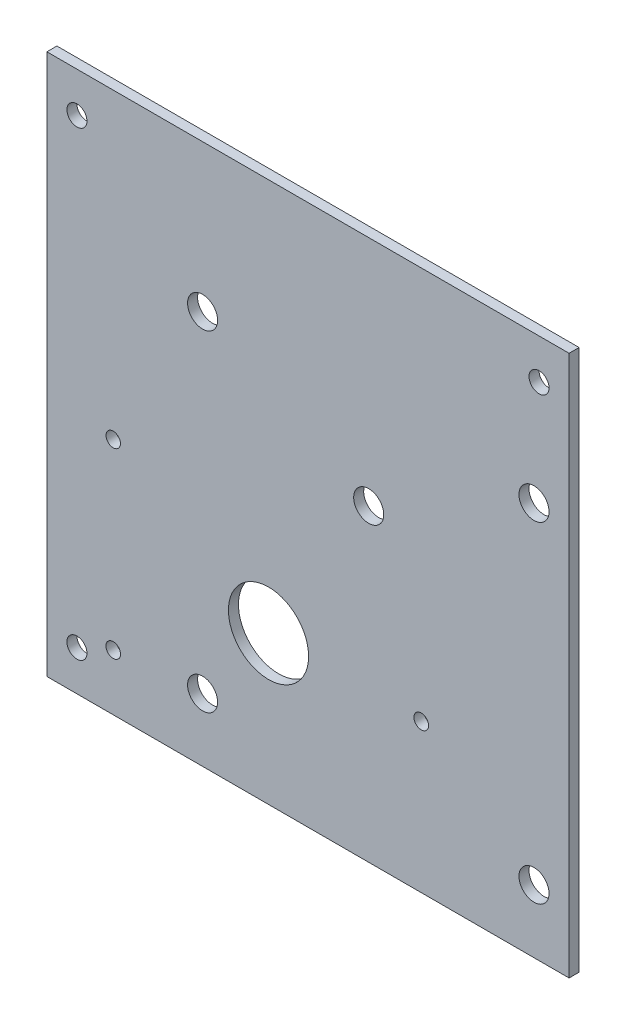
ISO-10303-21;
HEADER;
FILE_DESCRIPTION(('STEP AP214'),'2;1');
FILE_NAME('part.step','',(''),(''),'','','');
FILE_SCHEMA(('AUTOMOTIVE_DESIGN { 1 0 10303 214 1 1 1 1 }'));
ENDSEC;
DATA;
#1=APPLICATION_CONTEXT('core data for automotive mechanical design processes');
#2=APPLICATION_PROTOCOL_DEFINITION('international standard','automotive_design',2000,#1);
#3=PRODUCT_CONTEXT('',#1,'mechanical');
#4=PRODUCT('Part','Part','',(#3));
#5=PRODUCT_RELATED_PRODUCT_CATEGORY('part','',(#4));
#6=PRODUCT_DEFINITION_FORMATION('','',#4);
#7=PRODUCT_DEFINITION_CONTEXT('part definition',#1,'design');
#8=PRODUCT_DEFINITION('design','',#6,#7);
#9=PRODUCT_DEFINITION_SHAPE('','',#8);
#10=(LENGTH_UNIT() NAMED_UNIT(*) SI_UNIT(.MILLI.,.METRE.));
#11=(NAMED_UNIT(*) PLANE_ANGLE_UNIT() SI_UNIT($,.RADIAN.));
#12=(NAMED_UNIT(*) SI_UNIT($,.STERADIAN.) SOLID_ANGLE_UNIT());
#13=UNCERTAINTY_MEASURE_WITH_UNIT(LENGTH_MEASURE(1.E-05),#10,'distance_accuracy_value','');
#14=(GEOMETRIC_REPRESENTATION_CONTEXT(3) GLOBAL_UNCERTAINTY_ASSIGNED_CONTEXT((#13)) GLOBAL_UNIT_ASSIGNED_CONTEXT((#10,
#11,#12)) REPRESENTATION_CONTEXT('',''));
#15=CARTESIAN_POINT('',(0.,0.,0.));
#16=DIRECTION('',(0.,0.,1.));
#17=DIRECTION('',(1.,0.,0.));
#18=AXIS2_PLACEMENT_3D('',#15,#16,#17);
#19=CARTESIAN_POINT('',(0.,0.,3.175));
#20=DIRECTION('',(0.,0.,-1.));
#21=DIRECTION('',(-1.,0.,0.));
#22=AXIS2_PLACEMENT_3D('',#19,#20,#21);
#23=PLANE('',#22);
#24=CARTESIAN_POINT('',(155.956,158.75,3.175));
#25=DIRECTION('',(0.,0.,1.));
#26=DIRECTION('',(1.,0.,0.));
#27=AXIS2_PLACEMENT_3D('',#24,#25,#26);
#28=CIRCLE('',#27,3.17499999999997);
#29=CARTESIAN_POINT('',(159.131,158.75,3.175));
#30=VERTEX_POINT('',#29);
#31=EDGE_CURVE('E179',#30,#30,#28,.T.);
#32=ORIENTED_EDGE('',*,*,#31,.F.);
#33=EDGE_LOOP('',(#32));
#34=FACE_BOUND('',#33,.T.);
#35=CARTESIAN_POINT('',(9.525,12.7,3.175));
#36=DIRECTION('',(0.,0.,1.));
#37=DIRECTION('',(1.,0.,0.));
#38=AXIS2_PLACEMENT_3D('',#35,#36,#37);
#39=CIRCLE('',#38,3.175);
#40=CARTESIAN_POINT('',(12.7,12.7,3.175));
#41=VERTEX_POINT('',#40);
#42=EDGE_CURVE('E173',#41,#41,#39,.T.);
#43=ORIENTED_EDGE('',*,*,#42,.F.);
#44=EDGE_LOOP('',(#43));
#45=FACE_BOUND('',#44,.T.);
#46=CARTESIAN_POINT('',(9.525,158.75,3.175));
#47=DIRECTION('',(0.,0.,1.));
#48=DIRECTION('',(1.,0.,0.));
#49=AXIS2_PLACEMENT_3D('',#46,#47,#48);
#50=CIRCLE('',#49,3.175);
#51=CARTESIAN_POINT('',(12.7,158.75,3.175));
#52=VERTEX_POINT('',#51);
#53=EDGE_CURVE('E167',#52,#52,#50,.T.);
#54=ORIENTED_EDGE('',*,*,#53,.F.);
#55=EDGE_LOOP('',(#54));
#56=FACE_BOUND('',#55,.T.);
#57=CARTESIAN_POINT('',(154.3685,20.0025,3.175));
#58=DIRECTION('',(0.,0.,1.));
#59=DIRECTION('',(1.,0.,0.));
#60=AXIS2_PLACEMENT_3D('',#57,#58,#59);
#61=CIRCLE('',#60,4.76250000000001);
#62=CARTESIAN_POINT('',(159.131,20.0025,3.175));
#63=VERTEX_POINT('',#62);
#64=EDGE_CURVE('E150',#63,#63,#61,.T.);
#65=ORIENTED_EDGE('',*,*,#64,.F.);
#66=EDGE_LOOP('',(#65));
#67=FACE_BOUND('',#66,.T.);
#68=CARTESIAN_POINT('',(49.3395,20.0025,3.175));
#69=DIRECTION('',(0.,0.,1.));
#70=DIRECTION('',(1.,0.,0.));
#71=AXIS2_PLACEMENT_3D('',#68,#69,#70);
#72=CIRCLE('',#71,4.7625);
#73=CARTESIAN_POINT('',(54.102,20.0025,3.175));
#74=VERTEX_POINT('',#73);
#75=EDGE_CURVE('E138',#74,#74,#72,.T.);
#76=ORIENTED_EDGE('',*,*,#75,.F.);
#77=EDGE_LOOP('',(#76));
#78=FACE_BOUND('',#77,.T.);
#79=CARTESIAN_POINT('',(70.231,46.99,3.175));
#80=DIRECTION('',(0.,0.,1.));
#81=DIRECTION('',(1.,0.,0.));
#82=AXIS2_PLACEMENT_3D('',#79,#80,#81);
#83=CIRCLE('',#82,12.7);
#84=CARTESIAN_POINT('',(82.931,46.99,3.175));
#85=VERTEX_POINT('',#84);
#86=EDGE_CURVE('E126',#85,#85,#83,.T.);
#87=ORIENTED_EDGE('',*,*,#86,.F.);
#88=EDGE_LOOP('',(#87));
#89=FACE_BOUND('',#88,.T.);
#90=CARTESIAN_POINT('',(21.0185,75.565,3.175));
#91=DIRECTION('',(0.,0.,1.));
#92=DIRECTION('',(1.,0.,0.));
#93=AXIS2_PLACEMENT_3D('',#90,#91,#92);
#94=CIRCLE('',#93,2.286);
#95=CARTESIAN_POINT('',(23.3045,75.565,3.175));
#96=VERTEX_POINT('',#95);
#97=EDGE_CURVE('E114',#96,#96,#94,.T.);
#98=ORIENTED_EDGE('',*,*,#97,.F.);
#99=EDGE_LOOP('',(#98));
#100=FACE_BOUND('',#99,.T.);
#101=DIRECTION('',(0.,-1.,0.));
#102=VECTOR('',#101,1.);
#103=CARTESIAN_POINT('',(0.,0.,3.175));
#104=LINE('',#103,#102);
#105=CARTESIAN_POINT('',(0.,171.45,3.175));
#106=VERTEX_POINT('',#105);
#107=CARTESIAN_POINT('',(0.,0.,3.175));
#108=VERTEX_POINT('',#107);
#109=EDGE_CURVE('E84',#106,#108,#104,.T.);
#110=ORIENTED_EDGE('',*,*,#109,.T.);
#111=DIRECTION('',(1.,0.,0.));
#112=VECTOR('',#111,1.);
#113=CARTESIAN_POINT('',(0.,0.,3.175));
#114=LINE('',#113,#112);
#115=CARTESIAN_POINT('',(165.481,0.,3.175));
#116=VERTEX_POINT('',#115);
#117=EDGE_CURVE('E79',#108,#116,#114,.T.);
#118=ORIENTED_EDGE('',*,*,#117,.T.);
#119=DIRECTION('',(0.,1.,0.));
#120=VECTOR('',#119,1.);
#121=CARTESIAN_POINT('',(165.481,0.,3.175));
#122=LINE('',#121,#120);
#123=CARTESIAN_POINT('',(165.481,171.45,3.175));
#124=VERTEX_POINT('',#123);
#125=EDGE_CURVE('E82',#116,#124,#122,.T.);
#126=ORIENTED_EDGE('',*,*,#125,.T.);
#127=DIRECTION('',(-1.,0.,0.));
#128=VECTOR('',#127,1.);
#129=CARTESIAN_POINT('',(0.,171.45,3.175));
#130=LINE('',#129,#128);
#131=EDGE_CURVE('E49',#124,#106,#130,.T.);
#132=ORIENTED_EDGE('',*,*,#131,.T.);
#133=EDGE_LOOP('',(#110,#118,#126,#132));
#134=FACE_BOUND('',#133,.T.);
#135=CARTESIAN_POINT('',(21.0185,17.78,3.175));
#136=DIRECTION('',(0.,0.,1.));
#137=DIRECTION('',(1.,0.,0.));
#138=AXIS2_PLACEMENT_3D('',#135,#136,#137);
#139=CIRCLE('',#138,2.31775);
#140=CARTESIAN_POINT('',(23.33625,17.78,3.175));
#141=VERTEX_POINT('',#140);
#142=EDGE_CURVE('E99',#141,#141,#139,.T.);
#143=ORIENTED_EDGE('',*,*,#142,.F.);
#144=EDGE_LOOP('',(#143));
#145=FACE_BOUND('',#144,.T.);
#146=CARTESIAN_POINT('',(118.6307,46.99,3.175));
#147=DIRECTION('',(0.,0.,1.));
#148=DIRECTION('',(1.,0.,0.));
#149=AXIS2_PLACEMENT_3D('',#146,#147,#148);
#150=CIRCLE('',#149,2.31775);
#151=CARTESIAN_POINT('',(120.94845,46.99,3.175));
#152=VERTEX_POINT('',#151);
#153=EDGE_CURVE('E120',#152,#152,#150,.T.);
#154=ORIENTED_EDGE('',*,*,#153,.F.);
#155=EDGE_LOOP('',(#154));
#156=FACE_BOUND('',#155,.T.);
#157=CARTESIAN_POINT('',(101.981,97.79,3.175));
#158=DIRECTION('',(0.,0.,1.));
#159=DIRECTION('',(1.,0.,0.));
#160=AXIS2_PLACEMENT_3D('',#157,#158,#159);
#161=CIRCLE('',#160,4.7625);
#162=CARTESIAN_POINT('',(106.7435,97.79,3.175));
#163=VERTEX_POINT('',#162);
#164=EDGE_CURVE('E132',#163,#163,#161,.T.);
#165=ORIENTED_EDGE('',*,*,#164,.F.);
#166=EDGE_LOOP('',(#165));
#167=FACE_BOUND('',#166,.T.);
#168=CARTESIAN_POINT('',(49.3395,124.7775,3.175));
#169=DIRECTION('',(0.,0.,1.));
#170=DIRECTION('',(1.,0.,0.));
#171=AXIS2_PLACEMENT_3D('',#168,#169,#170);
#172=CIRCLE('',#171,4.7625);
#173=CARTESIAN_POINT('',(54.102,124.7775,3.175));
#174=VERTEX_POINT('',#173);
#175=EDGE_CURVE('E144',#174,#174,#172,.T.);
#176=ORIENTED_EDGE('',*,*,#175,.F.);
#177=EDGE_LOOP('',(#176));
#178=FACE_BOUND('',#177,.T.);
#179=CARTESIAN_POINT('',(154.3685,124.7775,3.175));
#180=DIRECTION('',(0.,0.,1.));
#181=DIRECTION('',(1.,0.,0.));
#182=AXIS2_PLACEMENT_3D('',#179,#180,#181);
#183=CIRCLE('',#182,4.76250000000001);
#184=CARTESIAN_POINT('',(159.131,124.7775,3.175));
#185=VERTEX_POINT('',#184);
#186=EDGE_CURVE('E156',#185,#185,#183,.T.);
#187=ORIENTED_EDGE('',*,*,#186,.F.);
#188=EDGE_LOOP('',(#187));
#189=FACE_BOUND('',#188,.T.);
#190=ADVANCED_FACE('F32',(#34,#45,#56,#67,#78,#89,#100,#134,#145,#156,#167,#178,#189),#23,.F.);
#191=CARTESIAN_POINT('',(0.,0.,0.));
#192=DIRECTION('',(0.,0.,-1.));
#193=DIRECTION('',(-1.,0.,0.));
#194=AXIS2_PLACEMENT_3D('',#191,#192,#193);
#195=PLANE('',#194);
#196=CARTESIAN_POINT('',(155.956,158.75,0.));
#197=DIRECTION('',(0.,0.,-1.));
#198=DIRECTION('',(-1.,0.,0.));
#199=AXIS2_PLACEMENT_3D('',#196,#197,#198);
#200=CIRCLE('',#199,3.17499999999997);
#201=CARTESIAN_POINT('',(152.781,158.75,0.));
#202=VERTEX_POINT('',#201);
#203=EDGE_CURVE('E176',#202,#202,#200,.F.);
#204=ORIENTED_EDGE('',*,*,#203,.T.);
#205=EDGE_LOOP('',(#204));
#206=FACE_BOUND('',#205,.T.);
#207=CARTESIAN_POINT('',(9.525,12.7,0.));
#208=DIRECTION('',(0.,0.,-1.));
#209=DIRECTION('',(-1.,0.,0.));
#210=AXIS2_PLACEMENT_3D('',#207,#208,#209);
#211=CIRCLE('',#210,3.175);
#212=CARTESIAN_POINT('',(6.35,12.7,0.));
#213=VERTEX_POINT('',#212);
#214=EDGE_CURVE('E170',#213,#213,#211,.F.);
#215=ORIENTED_EDGE('',*,*,#214,.T.);
#216=EDGE_LOOP('',(#215));
#217=FACE_BOUND('',#216,.T.);
#218=CARTESIAN_POINT('',(9.525,158.75,0.));
#219=DIRECTION('',(0.,0.,-1.));
#220=DIRECTION('',(-1.,0.,0.));
#221=AXIS2_PLACEMENT_3D('',#218,#219,#220);
#222=CIRCLE('',#221,3.175);
#223=CARTESIAN_POINT('',(6.35,158.75,0.));
#224=VERTEX_POINT('',#223);
#225=EDGE_CURVE('E162',#224,#224,#222,.F.);
#226=ORIENTED_EDGE('',*,*,#225,.T.);
#227=EDGE_LOOP('',(#226));
#228=FACE_BOUND('',#227,.T.);
#229=CARTESIAN_POINT('',(154.3685,20.0025,0.));
#230=DIRECTION('',(0.,0.,1.));
#231=DIRECTION('',(1.,0.,0.));
#232=AXIS2_PLACEMENT_3D('',#229,#230,#231);
#233=CIRCLE('',#232,4.76250000000001);
#234=CARTESIAN_POINT('',(159.131,20.0025,0.));
#235=VERTEX_POINT('',#234);
#236=EDGE_CURVE('E153',#235,#235,#233,.T.);
#237=ORIENTED_EDGE('',*,*,#236,.T.);
#238=EDGE_LOOP('',(#237));
#239=FACE_BOUND('',#238,.T.);
#240=CARTESIAN_POINT('',(49.3395,20.0025,0.));
#241=DIRECTION('',(0.,0.,1.));
#242=DIRECTION('',(1.,0.,0.));
#243=AXIS2_PLACEMENT_3D('',#240,#241,#242);
#244=CIRCLE('',#243,4.7625);
#245=CARTESIAN_POINT('',(54.102,20.0025,0.));
#246=VERTEX_POINT('',#245);
#247=EDGE_CURVE('E141',#246,#246,#244,.T.);
#248=ORIENTED_EDGE('',*,*,#247,.T.);
#249=EDGE_LOOP('',(#248));
#250=FACE_BOUND('',#249,.T.);
#251=CARTESIAN_POINT('',(70.231,46.99,0.));
#252=DIRECTION('',(0.,0.,1.));
#253=DIRECTION('',(1.,0.,0.));
#254=AXIS2_PLACEMENT_3D('',#251,#252,#253);
#255=CIRCLE('',#254,12.7);
#256=CARTESIAN_POINT('',(82.931,46.99,0.));
#257=VERTEX_POINT('',#256);
#258=EDGE_CURVE('E129',#257,#257,#255,.T.);
#259=ORIENTED_EDGE('',*,*,#258,.T.);
#260=EDGE_LOOP('',(#259));
#261=FACE_BOUND('',#260,.T.);
#262=CARTESIAN_POINT('',(21.0185,75.565,0.));
#263=DIRECTION('',(0.,0.,1.));
#264=DIRECTION('',(1.,0.,0.));
#265=AXIS2_PLACEMENT_3D('',#262,#263,#264);
#266=CIRCLE('',#265,2.286);
#267=CARTESIAN_POINT('',(23.3045,75.565,0.));
#268=VERTEX_POINT('',#267);
#269=EDGE_CURVE('E117',#268,#268,#266,.T.);
#270=ORIENTED_EDGE('',*,*,#269,.T.);
#271=EDGE_LOOP('',(#270));
#272=FACE_BOUND('',#271,.T.);
#273=DIRECTION('',(0.,-1.,0.));
#274=VECTOR('',#273,1.);
#275=CARTESIAN_POINT('',(0.,0.,0.));
#276=LINE('',#275,#274);
#277=CARTESIAN_POINT('',(0.,171.45,0.));
#278=VERTEX_POINT('',#277);
#279=CARTESIAN_POINT('',(0.,0.,0.));
#280=VERTEX_POINT('',#279);
#281=EDGE_CURVE('E96',#278,#280,#276,.T.);
#282=ORIENTED_EDGE('',*,*,#281,.F.);
#283=DIRECTION('',(-1.,0.,0.));
#284=VECTOR('',#283,1.);
#285=CARTESIAN_POINT('',(0.,171.45,0.));
#286=LINE('',#285,#284);
#287=CARTESIAN_POINT('',(165.481,171.45,0.));
#288=VERTEX_POINT('',#287);
#289=EDGE_CURVE('E72',#288,#278,#286,.T.);
#290=ORIENTED_EDGE('',*,*,#289,.F.);
#291=DIRECTION('',(0.,1.,0.));
#292=VECTOR('',#291,1.);
#293=CARTESIAN_POINT('',(165.481,0.,0.));
#294=LINE('',#293,#292);
#295=CARTESIAN_POINT('',(165.481,0.,0.));
#296=VERTEX_POINT('',#295);
#297=EDGE_CURVE('E66',#296,#288,#294,.T.);
#298=ORIENTED_EDGE('',*,*,#297,.F.);
#299=DIRECTION('',(1.,0.,0.));
#300=VECTOR('',#299,1.);
#301=CARTESIAN_POINT('',(0.,0.,0.));
#302=LINE('',#301,#300);
#303=EDGE_CURVE('E88',#280,#296,#302,.T.);
#304=ORIENTED_EDGE('',*,*,#303,.F.);
#305=EDGE_LOOP('',(#282,#290,#298,#304));
#306=FACE_BOUND('',#305,.T.);
#307=CARTESIAN_POINT('',(21.0185,17.78,0.));
#308=DIRECTION('',(0.,0.,1.));
#309=DIRECTION('',(1.,0.,0.));
#310=AXIS2_PLACEMENT_3D('',#307,#308,#309);
#311=CIRCLE('',#310,2.31775);
#312=CARTESIAN_POINT('',(23.33625,17.78,0.));
#313=VERTEX_POINT('',#312);
#314=EDGE_CURVE('E111',#313,#313,#311,.T.);
#315=ORIENTED_EDGE('',*,*,#314,.T.);
#316=EDGE_LOOP('',(#315));
#317=FACE_BOUND('',#316,.T.);
#318=CARTESIAN_POINT('',(118.6307,46.99,0.));
#319=DIRECTION('',(0.,0.,1.));
#320=DIRECTION('',(1.,0.,0.));
#321=AXIS2_PLACEMENT_3D('',#318,#319,#320);
#322=CIRCLE('',#321,2.31775);
#323=CARTESIAN_POINT('',(120.94845,46.99,0.));
#324=VERTEX_POINT('',#323);
#325=EDGE_CURVE('E123',#324,#324,#322,.T.);
#326=ORIENTED_EDGE('',*,*,#325,.T.);
#327=EDGE_LOOP('',(#326));
#328=FACE_BOUND('',#327,.T.);
#329=CARTESIAN_POINT('',(101.981,97.79,0.));
#330=DIRECTION('',(0.,0.,1.));
#331=DIRECTION('',(1.,0.,0.));
#332=AXIS2_PLACEMENT_3D('',#329,#330,#331);
#333=CIRCLE('',#332,4.7625);
#334=CARTESIAN_POINT('',(106.7435,97.79,0.));
#335=VERTEX_POINT('',#334);
#336=EDGE_CURVE('E135',#335,#335,#333,.T.);
#337=ORIENTED_EDGE('',*,*,#336,.T.);
#338=EDGE_LOOP('',(#337));
#339=FACE_BOUND('',#338,.T.);
#340=CARTESIAN_POINT('',(49.3395,124.7775,0.));
#341=DIRECTION('',(0.,0.,1.));
#342=DIRECTION('',(1.,0.,0.));
#343=AXIS2_PLACEMENT_3D('',#340,#341,#342);
#344=CIRCLE('',#343,4.7625);
#345=CARTESIAN_POINT('',(54.102,124.7775,0.));
#346=VERTEX_POINT('',#345);
#347=EDGE_CURVE('E147',#346,#346,#344,.T.);
#348=ORIENTED_EDGE('',*,*,#347,.T.);
#349=EDGE_LOOP('',(#348));
#350=FACE_BOUND('',#349,.T.);
#351=CARTESIAN_POINT('',(154.3685,124.7775,0.));
#352=DIRECTION('',(0.,0.,1.));
#353=DIRECTION('',(1.,0.,0.));
#354=AXIS2_PLACEMENT_3D('',#351,#352,#353);
#355=CIRCLE('',#354,4.76250000000001);
#356=CARTESIAN_POINT('',(159.131,124.7775,0.));
#357=VERTEX_POINT('',#356);
#358=EDGE_CURVE('E159',#357,#357,#355,.T.);
#359=ORIENTED_EDGE('',*,*,#358,.T.);
#360=EDGE_LOOP('',(#359));
#361=FACE_BOUND('',#360,.T.);
#362=ADVANCED_FACE('F107',(#206,#217,#228,#239,#250,#261,#272,#306,#317,#328,#339,#350,#361),
#195,.T.);
#363=CARTESIAN_POINT('',(0.,0.,3.175));
#364=DIRECTION('',(1.,0.,0.));
#365=DIRECTION('',(0.,0.,-1.));
#366=AXIS2_PLACEMENT_3D('',#363,#364,#365);
#367=PLANE('',#366);
#368=ORIENTED_EDGE('',*,*,#281,.T.);
#369=DIRECTION('',(0.,0.,-1.));
#370=VECTOR('',#369,1.);
#371=CARTESIAN_POINT('',(0.,0.,3.175));
#372=LINE('',#371,#370);
#373=EDGE_CURVE('E11',#108,#280,#372,.T.);
#374=ORIENTED_EDGE('',*,*,#373,.F.);
#375=ORIENTED_EDGE('',*,*,#109,.F.);
#376=DIRECTION('',(0.,0.,-1.));
#377=VECTOR('',#376,1.);
#378=CARTESIAN_POINT('',(0.,171.45,3.175));
#379=LINE('',#378,#377);
#380=EDGE_CURVE('E92',#106,#278,#379,.T.);
#381=ORIENTED_EDGE('',*,*,#380,.T.);
#382=EDGE_LOOP('',(#368,#374,#375,#381));
#383=FACE_BOUND('',#382,.T.);
#384=ADVANCED_FACE('F34',(#383),#367,.F.);
#385=CARTESIAN_POINT('',(0.,0.,3.175));
#386=DIRECTION('',(0.,1.,0.));
#387=DIRECTION('',(0.,0.,1.));
#388=AXIS2_PLACEMENT_3D('',#385,#386,#387);
#389=PLANE('',#388);
#390=ORIENTED_EDGE('',*,*,#303,.T.);
#391=DIRECTION('',(0.,0.,-1.));
#392=VECTOR('',#391,1.);
#393=CARTESIAN_POINT('',(165.481,0.,3.175));
#394=LINE('',#393,#392);
#395=EDGE_CURVE('E41',#116,#296,#394,.T.);
#396=ORIENTED_EDGE('',*,*,#395,.F.);
#397=ORIENTED_EDGE('',*,*,#117,.F.);
#398=ORIENTED_EDGE('',*,*,#373,.T.);
#399=EDGE_LOOP('',(#390,#396,#397,#398));
#400=FACE_BOUND('',#399,.T.);
#401=ADVANCED_FACE('F87',(#400),#389,.F.);
#402=CARTESIAN_POINT('',(165.481,0.,3.175));
#403=DIRECTION('',(-1.,0.,0.));
#404=DIRECTION('',(0.,0.,1.));
#405=AXIS2_PLACEMENT_3D('',#402,#403,#404);
#406=PLANE('',#405);
#407=ORIENTED_EDGE('',*,*,#297,.T.);
#408=DIRECTION('',(0.,0.,-1.));
#409=VECTOR('',#408,1.);
#410=CARTESIAN_POINT('',(165.481,171.45,3.175));
#411=LINE('',#410,#409);
#412=EDGE_CURVE('E89',#124,#288,#411,.T.);
#413=ORIENTED_EDGE('',*,*,#412,.F.);
#414=ORIENTED_EDGE('',*,*,#125,.F.);
#415=ORIENTED_EDGE('',*,*,#395,.T.);
#416=EDGE_LOOP('',(#407,#413,#414,#415));
#417=FACE_BOUND('',#416,.T.);
#418=ADVANCED_FACE('F90',(#417),#406,.F.);
#419=CARTESIAN_POINT('',(0.,171.45,3.175));
#420=DIRECTION('',(0.,-1.,0.));
#421=DIRECTION('',(0.,0.,-1.));
#422=AXIS2_PLACEMENT_3D('',#419,#420,#421);
#423=PLANE('',#422);
#424=ORIENTED_EDGE('',*,*,#289,.T.);
#425=ORIENTED_EDGE('',*,*,#380,.F.);
#426=ORIENTED_EDGE('',*,*,#131,.F.);
#427=ORIENTED_EDGE('',*,*,#412,.T.);
#428=EDGE_LOOP('',(#424,#425,#426,#427));
#429=FACE_BOUND('',#428,.T.);
#430=ADVANCED_FACE('F104',(#429),#423,.F.);
#431=CARTESIAN_POINT('',(21.0185,17.78,3.175));
#432=DIRECTION('',(0.,0.,-1.));
#433=DIRECTION('',(-1.,0.,0.));
#434=AXIS2_PLACEMENT_3D('',#431,#432,#433);
#435=CYLINDRICAL_SURFACE('',#434,2.31775);
#436=ORIENTED_EDGE('',*,*,#142,.T.);
#437=EDGE_LOOP('',(#436));
#438=FACE_BOUND('',#437,.T.);
#439=ORIENTED_EDGE('',*,*,#314,.F.);
#440=EDGE_LOOP('',(#439));
#441=FACE_BOUND('',#440,.T.);
#442=ADVANCED_FACE('F205',(#438,#441),#435,.F.);
#443=CARTESIAN_POINT('',(21.0185,75.565,3.175));
#444=DIRECTION('',(0.,0.,-1.));
#445=DIRECTION('',(-1.,0.,0.));
#446=AXIS2_PLACEMENT_3D('',#443,#444,#445);
#447=CYLINDRICAL_SURFACE('',#446,2.286);
#448=ORIENTED_EDGE('',*,*,#97,.T.);
#449=EDGE_LOOP('',(#448));
#450=FACE_BOUND('',#449,.T.);
#451=ORIENTED_EDGE('',*,*,#269,.F.);
#452=EDGE_LOOP('',(#451));
#453=FACE_BOUND('',#452,.T.);
#454=ADVANCED_FACE('F201',(#450,#453),#447,.F.);
#455=CARTESIAN_POINT('',(118.6307,46.99,3.175));
#456=DIRECTION('',(0.,0.,-1.));
#457=DIRECTION('',(-1.,0.,0.));
#458=AXIS2_PLACEMENT_3D('',#455,#456,#457);
#459=CYLINDRICAL_SURFACE('',#458,2.31775);
#460=ORIENTED_EDGE('',*,*,#153,.T.);
#461=EDGE_LOOP('',(#460));
#462=FACE_BOUND('',#461,.T.);
#463=ORIENTED_EDGE('',*,*,#325,.F.);
#464=EDGE_LOOP('',(#463));
#465=FACE_BOUND('',#464,.T.);
#466=ADVANCED_FACE('F204',(#462,#465),#459,.F.);
#467=CARTESIAN_POINT('',(70.231,46.99,3.175));
#468=DIRECTION('',(0.,0.,-1.));
#469=DIRECTION('',(-1.,0.,0.));
#470=AXIS2_PLACEMENT_3D('',#467,#468,#469);
#471=CYLINDRICAL_SURFACE('',#470,12.7);
#472=ORIENTED_EDGE('',*,*,#86,.T.);
#473=EDGE_LOOP('',(#472));
#474=FACE_BOUND('',#473,.T.);
#475=ORIENTED_EDGE('',*,*,#258,.F.);
#476=EDGE_LOOP('',(#475));
#477=FACE_BOUND('',#476,.T.);
#478=ADVANCED_FACE('F250',(#474,#477),#471,.F.);
#479=CARTESIAN_POINT('',(101.981,97.79,3.175));
#480=DIRECTION('',(0.,0.,-1.));
#481=DIRECTION('',(-1.,0.,0.));
#482=AXIS2_PLACEMENT_3D('',#479,#480,#481);
#483=CYLINDRICAL_SURFACE('',#482,4.7625);
#484=ORIENTED_EDGE('',*,*,#164,.T.);
#485=EDGE_LOOP('',(#484));
#486=FACE_BOUND('',#485,.T.);
#487=ORIENTED_EDGE('',*,*,#336,.F.);
#488=EDGE_LOOP('',(#487));
#489=FACE_BOUND('',#488,.T.);
#490=ADVANCED_FACE('F258',(#486,#489),#483,.F.);
#491=CARTESIAN_POINT('',(49.3395,20.0025,3.175));
#492=DIRECTION('',(0.,0.,-1.));
#493=DIRECTION('',(-1.,0.,0.));
#494=AXIS2_PLACEMENT_3D('',#491,#492,#493);
#495=CYLINDRICAL_SURFACE('',#494,4.7625);
#496=ORIENTED_EDGE('',*,*,#75,.T.);
#497=EDGE_LOOP('',(#496));
#498=FACE_BOUND('',#497,.T.);
#499=ORIENTED_EDGE('',*,*,#247,.F.);
#500=EDGE_LOOP('',(#499));
#501=FACE_BOUND('',#500,.T.);
#502=ADVANCED_FACE('F266',(#498,#501),#495,.F.);
#503=CARTESIAN_POINT('',(49.3395,124.7775,3.175));
#504=DIRECTION('',(0.,0.,-1.));
#505=DIRECTION('',(-1.,0.,0.));
#506=AXIS2_PLACEMENT_3D('',#503,#504,#505);
#507=CYLINDRICAL_SURFACE('',#506,4.7625);
#508=ORIENTED_EDGE('',*,*,#175,.T.);
#509=EDGE_LOOP('',(#508));
#510=FACE_BOUND('',#509,.T.);
#511=ORIENTED_EDGE('',*,*,#347,.F.);
#512=EDGE_LOOP('',(#511));
#513=FACE_BOUND('',#512,.T.);
#514=ADVANCED_FACE('F274',(#510,#513),#507,.F.);
#515=CARTESIAN_POINT('',(154.3685,20.0025,3.175));
#516=DIRECTION('',(0.,0.,-1.));
#517=DIRECTION('',(-1.,0.,0.));
#518=AXIS2_PLACEMENT_3D('',#515,#516,#517);
#519=CYLINDRICAL_SURFACE('',#518,4.76250000000001);
#520=ORIENTED_EDGE('',*,*,#64,.T.);
#521=EDGE_LOOP('',(#520));
#522=FACE_BOUND('',#521,.T.);
#523=ORIENTED_EDGE('',*,*,#236,.F.);
#524=EDGE_LOOP('',(#523));
#525=FACE_BOUND('',#524,.T.);
#526=ADVANCED_FACE('F282',(#522,#525),#519,.F.);
#527=CARTESIAN_POINT('',(154.3685,124.7775,3.175));
#528=DIRECTION('',(0.,0.,-1.));
#529=DIRECTION('',(-1.,0.,0.));
#530=AXIS2_PLACEMENT_3D('',#527,#528,#529);
#531=CYLINDRICAL_SURFACE('',#530,4.76250000000001);
#532=ORIENTED_EDGE('',*,*,#186,.T.);
#533=EDGE_LOOP('',(#532));
#534=FACE_BOUND('',#533,.T.);
#535=ORIENTED_EDGE('',*,*,#358,.F.);
#536=EDGE_LOOP('',(#535));
#537=FACE_BOUND('',#536,.T.);
#538=ADVANCED_FACE('F290',(#534,#537),#531,.F.);
#539=CARTESIAN_POINT('',(9.525,158.75,-8.98025612106917));
#540=DIRECTION('',(0.,0.,1.));
#541=DIRECTION('',(1.,0.,0.));
#542=AXIS2_PLACEMENT_3D('',#539,#540,#541);
#543=CYLINDRICAL_SURFACE('',#542,3.175);
#544=ORIENTED_EDGE('',*,*,#53,.T.);
#545=EDGE_LOOP('',(#544));
#546=FACE_BOUND('',#545,.T.);
#547=ORIENTED_EDGE('',*,*,#225,.F.);
#548=EDGE_LOOP('',(#547));
#549=FACE_BOUND('',#548,.T.);
#550=ADVANCED_FACE('F298',(#546,#549),#543,.F.);
#551=CARTESIAN_POINT('',(9.525,12.7,-8.98025612106917));
#552=DIRECTION('',(0.,0.,1.));
#553=DIRECTION('',(1.,0.,0.));
#554=AXIS2_PLACEMENT_3D('',#551,#552,#553);
#555=CYLINDRICAL_SURFACE('',#554,3.175);
#556=ORIENTED_EDGE('',*,*,#42,.T.);
#557=EDGE_LOOP('',(#556));
#558=FACE_BOUND('',#557,.T.);
#559=ORIENTED_EDGE('',*,*,#214,.F.);
#560=EDGE_LOOP('',(#559));
#561=FACE_BOUND('',#560,.T.);
#562=ADVANCED_FACE('F307',(#558,#561),#555,.F.);
#563=CARTESIAN_POINT('',(155.956,158.75,-8.98025612106917));
#564=DIRECTION('',(0.,0.,1.));
#565=DIRECTION('',(1.,0.,0.));
#566=AXIS2_PLACEMENT_3D('',#563,#564,#565);
#567=CYLINDRICAL_SURFACE('',#566,3.17499999999997);
#568=ORIENTED_EDGE('',*,*,#31,.T.);
#569=EDGE_LOOP('',(#568));
#570=FACE_BOUND('',#569,.T.);
#571=ORIENTED_EDGE('',*,*,#203,.F.);
#572=EDGE_LOOP('',(#571));
#573=FACE_BOUND('',#572,.T.);
#574=ADVANCED_FACE('F183',(#570,#573),#567,.F.);
#575=CLOSED_SHELL('',(#190,#362,#384,#401,#418,#430,#442,#454,#466,#478,#490,#502,#514,#526,
#538,#550,#562,#574));
#576=MANIFOLD_SOLID_BREP('B2',#575);
#577=ADVANCED_BREP_SHAPE_REPRESENTATION('',(#18,#576),#14);
#578=SHAPE_DEFINITION_REPRESENTATION(#9,#577);
ENDSEC;
END-ISO-10303-21;
